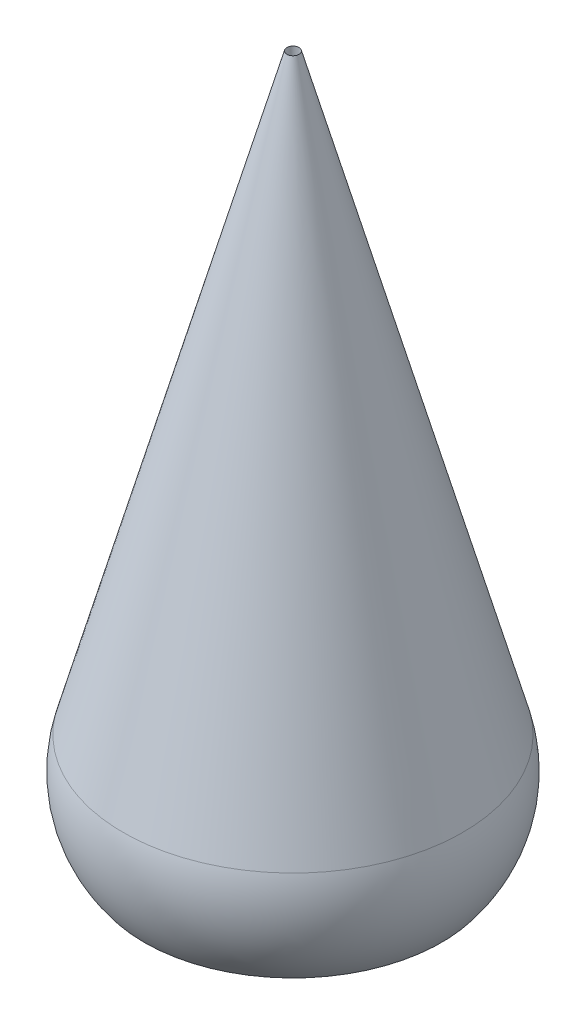
ISO-10303-21;
HEADER;
FILE_DESCRIPTION(('STEP AP214'),'2;1');
FILE_NAME('part.step','',(''),(''),'','','');
FILE_SCHEMA(('AUTOMOTIVE_DESIGN { 1 0 10303 214 1 1 1 1 }'));
ENDSEC;
DATA;
#1=APPLICATION_CONTEXT('core data for automotive mechanical design processes');
#2=APPLICATION_PROTOCOL_DEFINITION('international standard','automotive_design',2000,#1);
#3=PRODUCT_CONTEXT('',#1,'mechanical');
#4=PRODUCT('Part','Part','',(#3));
#5=PRODUCT_RELATED_PRODUCT_CATEGORY('part','',(#4));
#6=PRODUCT_DEFINITION_FORMATION('','',#4);
#7=PRODUCT_DEFINITION_CONTEXT('part definition',#1,'design');
#8=PRODUCT_DEFINITION('design','',#6,#7);
#9=PRODUCT_DEFINITION_SHAPE('','',#8);
#10=(LENGTH_UNIT() NAMED_UNIT(*) SI_UNIT(.MILLI.,.METRE.));
#11=(NAMED_UNIT(*) PLANE_ANGLE_UNIT() SI_UNIT($,.RADIAN.));
#12=(NAMED_UNIT(*) SI_UNIT($,.STERADIAN.) SOLID_ANGLE_UNIT());
#13=UNCERTAINTY_MEASURE_WITH_UNIT(LENGTH_MEASURE(1.E-05),#10,'distance_accuracy_value','');
#14=(GEOMETRIC_REPRESENTATION_CONTEXT(3) GLOBAL_UNCERTAINTY_ASSIGNED_CONTEXT((#13)) GLOBAL_UNIT_ASSIGNED_CONTEXT((#10,
#11,#12)) REPRESENTATION_CONTEXT('',''));
#15=CARTESIAN_POINT('',(0.,0.,0.));
#16=DIRECTION('',(0.,0.,1.));
#17=DIRECTION('',(1.,0.,0.));
#18=AXIS2_PLACEMENT_3D('',#15,#16,#17);
#19=CARTESIAN_POINT('',(0.,0.,0.));
#20=DIRECTION('',(0.,-1.,0.));
#21=DIRECTION('',(0.,0.,-1.));
#22=AXIS2_PLACEMENT_3D('',#19,#20,#21);
#23=CONICAL_SURFACE('',#22,12.4055754877515,0.269939481170051);
#24=CARTESIAN_POINT('',(0.,0.,0.));
#25=DIRECTION('',(0.,-1.,0.));
#26=DIRECTION('',(0.,0.,-1.));
#27=AXIS2_PLACEMENT_3D('',#24,#25,#26);
#28=CIRCLE('',#27,12.4055754877515);
#29=CARTESIAN_POINT('',(0.,0.,-12.4055754877515));
#30=VERTEX_POINT('',#29);
#31=EDGE_CURVE('E44',#30,#30,#28,.T.);
#32=CARTESIAN_POINT('',(0.,43.0281078034523,0.));
#33=DIRECTION('',(0.,-1.,0.));
#34=DIRECTION('',(0.,0.,-1.));
#35=AXIS2_PLACEMENT_3D('',#32,#33,#34);
#36=CIRCLE('',#35,0.5);
#37=CARTESIAN_POINT('',(0.,43.0281078034523,-0.500000000000002));
#38=VERTEX_POINT('',#37);
#39=EDGE_CURVE('E10',#38,#38,#36,.T.);
#40=CARTESIAN_POINT('',(0.,0.,-12.4055754877515));
#41=CARTESIAN_POINT('',(0.,0.448209456285961,-12.2815590764208));
#42=CARTESIAN_POINT('',(0.,0.896418912571923,-12.15754266509));
#43=CARTESIAN_POINT('',(0.,1.79283782514384,-11.9095098424286));
#44=CARTESIAN_POINT('',(0.,2.24104728142981,-11.7854934310978));
#45=CARTESIAN_POINT('',(0.,3.13746619400173,-11.5374606084363));
#46=CARTESIAN_POINT('',(0.,3.58567565028769,-11.4134441971056));
#47=CARTESIAN_POINT('',(0.,4.48209456285961,-11.1654113744441));
#48=CARTESIAN_POINT('',(0.,4.93030401914557,-11.0413949631133));
#49=CARTESIAN_POINT('',(0.,5.8267229317175,-10.7933621404518));
#50=CARTESIAN_POINT('',(0.,6.27493238800346,-10.6693457291211));
#51=CARTESIAN_POINT('',(0.,7.17135130057538,-10.4213129064596));
#52=CARTESIAN_POINT('',(0.,7.61956075686134,-10.2972964951289));
#53=CARTESIAN_POINT('',(0.,8.51597966943326,-10.0492636724674));
#54=CARTESIAN_POINT('',(0.,8.96418912571922,-9.92524726113663));
#55=CARTESIAN_POINT('',(0.,9.86060803829115,-9.67721443847514));
#56=CARTESIAN_POINT('',(0.,10.3088174945771,-9.5531980271444));
#57=CARTESIAN_POINT('',(0.,11.205236407149,-9.30516520448291));
#58=CARTESIAN_POINT('',(0.,11.653445863435,-9.18114879315216));
#59=CARTESIAN_POINT('',(0.,12.5498647760069,-8.93311597049067));
#60=CARTESIAN_POINT('',(0.,12.9980742322929,-8.80909955915993));
#61=CARTESIAN_POINT('',(0.,13.8944931448648,-8.56106673649844));
#62=CARTESIAN_POINT('',(0.,14.3427026011508,-8.43705032516769));
#63=CARTESIAN_POINT('',(0.,15.2391215137227,-8.1890175025062));
#64=CARTESIAN_POINT('',(0.,15.6873309700086,-8.06500109117546));
#65=CARTESIAN_POINT('',(0.,16.5837498825806,-7.81696826851396));
#66=CARTESIAN_POINT('',(0.,17.0319593388665,-7.69295185718322));
#67=CARTESIAN_POINT('',(0.,17.9283782514384,-7.44491903452173));
#68=CARTESIAN_POINT('',(0.,18.3765877077244,-7.32090262319098));
#69=CARTESIAN_POINT('',(0.,19.2730066202963,-7.07286980052949));
#70=CARTESIAN_POINT('',(0.,19.7212160765823,-6.94885338919875));
#71=CARTESIAN_POINT('',(0.,20.6176349891542,-6.70082056653726));
#72=CARTESIAN_POINT('',(0.,21.0658444454402,-6.57680415520651));
#73=CARTESIAN_POINT('',(0.,21.9622633580121,-6.32877133254502));
#74=CARTESIAN_POINT('',(0.,22.4104728142981,-6.20475492121428));
#75=CARTESIAN_POINT('',(0.,23.30689172687,-5.95672209855279));
#76=CARTESIAN_POINT('',(0.,23.7551011831559,-5.83270568722204));
#77=CARTESIAN_POINT('',(0.,24.6515200957279,-5.58467286456055));
#78=CARTESIAN_POINT('',(0.,25.0997295520138,-5.46065645322981));
#79=CARTESIAN_POINT('',(0.,25.9961484645857,-5.21262363056832));
#80=CARTESIAN_POINT('',(0.,26.4443579208717,-5.08860721923757));
#81=CARTESIAN_POINT('',(0.,27.3407768334436,-4.84057439657608));
#82=CARTESIAN_POINT('',(0.,27.7889862897296,-4.71655798524534));
#83=CARTESIAN_POINT('',(0.,28.6854052023015,-4.46852516258385));
#84=CARTESIAN_POINT('',(0.,29.1336146585875,-4.3445087512531));
#85=CARTESIAN_POINT('',(0.,30.0300335711594,-4.09647592859161));
#86=CARTESIAN_POINT('',(0.,30.4782430274454,-3.97245951726087));
#87=CARTESIAN_POINT('',(0.,31.3746619400173,-3.72442669459938));
#88=CARTESIAN_POINT('',(0.,31.8228713963032,-3.60041028326863));
#89=CARTESIAN_POINT('',(0.,32.7192903088752,-3.35237746060714));
#90=CARTESIAN_POINT('',(0.,33.1674997651611,-3.2283610492764));
#91=CARTESIAN_POINT('',(0.,34.063918677733,-2.9803282266149));
#92=CARTESIAN_POINT('',(0.,34.512128134019,-2.85631181528416));
#93=CARTESIAN_POINT('',(0.,35.4085470465909,-2.60827899262267));
#94=CARTESIAN_POINT('',(0.,35.8567565028769,-2.48426258129193));
#95=CARTESIAN_POINT('',(0.,36.7531754154488,-2.23622975863044));
#96=CARTESIAN_POINT('',(0.,37.2013848717348,-2.11221334729969));
#97=CARTESIAN_POINT('',(0.,38.0978037843067,-1.8641805246382));
#98=CARTESIAN_POINT('',(0.,38.5460132405927,-1.74016411330745));
#99=CARTESIAN_POINT('',(0.,39.4424321531646,-1.49213129064596));
#100=CARTESIAN_POINT('',(0.,39.8906416094505,-1.36811487931522));
#101=CARTESIAN_POINT('',(0.,40.7870605220225,-1.12008205665373));
#102=CARTESIAN_POINT('',(0.,41.2352699783084,-0.996065645322982));
#103=CARTESIAN_POINT('',(0.,42.1316888908803,-0.748032822661491));
#104=CARTESIAN_POINT('',(0.,42.5798983471663,-0.624016411330746));
#105=CARTESIAN_POINT('',(0.,43.0281078034523,-0.500000000000002));
#106=B_SPLINE_CURVE_WITH_KNOTS('',3,(#40,#41,#42,#43,#44,#45,#46,#47,#48,#49,#50,#51,#52,#53,
#54,#55,#56,#57,#58,#59,#60,#61,#62,#63,#64,#65,#66,#67,#68,#69,#70,#71,#72,#73,#74,#75,#76,#77,
#78,#79,#80,#81,#82,#83,#84,#85,#86,#87,#88,#89,#90,#91,#92,#93,#94,#95,#96,#97,#98,#99,#100,
#101,#102,#103,#104,#105),.UNSPECIFIED.,.F.,.F.,(4,2,2,2,2,2,2,2,2,2,2,2,2,2,2,2,2,2,2,2,2,2,2,
2,2,2,2,2,2,2,2,2,4),(0.,1.39515091758979,2.79030183517957,4.18545275276936,5.58060367035914,
6.97575458794893,8.37090550553872,9.7660564231285,11.1612073407183,12.5563582583081,
13.9515091758979,15.3466600934876,16.7418110110774,18.1369619286672,19.532112846257,
20.9272637638468,22.3224146814366,23.7175655990264,25.1127165166161,26.5078674342059,
27.9030183517957,29.2981692693855,30.6933201869753,32.0884711045651,33.4836220221549,
34.8787729397446,36.2739238573344,37.6690747749242,39.064225692514,40.4593766101038,
41.8545275276936,43.2496784452834,44.6448293628732),.UNSPECIFIED.);
#107=EDGE_CURVE('BSEAM32',#30,#38,#106,.T.);
#108=ORIENTED_EDGE('',*,*,#31,.T.);
#109=ORIENTED_EDGE('',*,*,#39,.F.);
#110=ORIENTED_EDGE('',*,*,#107,.T.);
#111=ORIENTED_EDGE('',*,*,#107,.F.);
#112=EDGE_LOOP('',(#108,#110,#109,#111));
#113=FACE_BOUND('',#112,.T.);
#114=ADVANCED_FACE('F32',(#113),#23,.F.);
#115=CARTESIAN_POINT('',(0.,60.,0.));
#116=DIRECTION('',(0.,-1.,0.));
#117=DIRECTION('',(0.,0.,-1.));
#118=AXIS2_PLACEMENT_3D('',#115,#116,#117);
#119=CONICAL_SURFACE('',#118,0.,0.269939481170051);
#120=CARTESIAN_POINT('',(0.,8.82039860241067,0.));
#121=DIRECTION('',(0.,1.,0.));
#122=DIRECTION('',(0.,0.,1.));
#123=AXIS2_PLACEMENT_3D('',#120,#121,#122);
#124=CIRCLE('',#123,14.1610365637121);
#125=CARTESIAN_POINT('',(0.,8.82039860241067,-14.1610365637121));
#126=VERTEX_POINT('',#125);
#127=EDGE_CURVE('E36',#126,#126,#124,.T.);
#128=CARTESIAN_POINT('',(0.,58.1929429682874,0.));
#129=DIRECTION('',(0.,-1.,0.));
#130=DIRECTION('',(0.,0.,-1.));
#131=AXIS2_PLACEMENT_3D('',#128,#129,#130);
#132=CIRCLE('',#131,0.5);
#133=CARTESIAN_POINT('',(0.,58.1929429682874,-0.499999999999999));
#134=VERTEX_POINT('',#133);
#135=EDGE_CURVE('E52',#134,#134,#132,.T.);
#136=CARTESIAN_POINT('',(0.,8.82039860241067,-14.1610365637121));
#137=CARTESIAN_POINT('',(0.,9.33469593955522,-14.0187340995068));
#138=CARTESIAN_POINT('',(0.,9.84899327669977,-13.8764316353014));
#139=CARTESIAN_POINT('',(0.,10.8775879509889,-13.5918267068908));
#140=CARTESIAN_POINT('',(0.,11.3918852881334,-13.4495242426854));
#141=CARTESIAN_POINT('',(0.,12.4204799624225,-13.1649193142748));
#142=CARTESIAN_POINT('',(0.,12.9347772995671,-13.0226168500694));
#143=CARTESIAN_POINT('',(0.,13.9633719738562,-12.7380119216588));
#144=CARTESIAN_POINT('',(0.,14.4776693110007,-12.5957094574534));
#145=CARTESIAN_POINT('',(0.,15.5062639852898,-12.3111045290428));
#146=CARTESIAN_POINT('',(0.,16.0205613224344,-12.1688020648374));
#147=CARTESIAN_POINT('',(0.,17.0491559967235,-11.8841971364267));
#148=CARTESIAN_POINT('',(0.,17.563453333868,-11.7418946722214));
#149=CARTESIAN_POINT('',(0.,18.5920480081571,-11.4572897438107));
#150=CARTESIAN_POINT('',(0.,19.1063453453017,-11.3149872796054));
#151=CARTESIAN_POINT('',(0.,20.1349400195908,-11.0303823511947));
#152=CARTESIAN_POINT('',(0.,20.6492373567353,-10.8880798869894));
#153=CARTESIAN_POINT('',(0.,21.6778320310244,-10.6034749585787));
#154=CARTESIAN_POINT('',(0.,22.192129368169,-10.4611724943734));
#155=CARTESIAN_POINT('',(0.,23.2207240424581,-10.1765675659627));
#156=CARTESIAN_POINT('',(0.,23.7350213796026,-10.0342651017574));
#157=CARTESIAN_POINT('',(0.,24.7636160538917,-9.74966017334673));
#158=CARTESIAN_POINT('',(0.,25.2779133910363,-9.6073577091414));
#159=CARTESIAN_POINT('',(0.,26.3065080653254,-9.32275278073073));
#160=CARTESIAN_POINT('',(0.,26.8208054024699,-9.1804503165254));
#161=CARTESIAN_POINT('',(0.,27.849400076759,-8.89584538811473));
#162=CARTESIAN_POINT('',(0.,28.3636974139036,-8.75354292390939));
#163=CARTESIAN_POINT('',(0.,29.3922920881927,-8.46893799549872));
#164=CARTESIAN_POINT('',(0.,29.9065894253372,-8.32663553129339));
#165=CARTESIAN_POINT('',(0.,30.9351840996263,-8.04203060288272));
#166=CARTESIAN_POINT('',(0.,31.4494814367708,-7.89972813867739));
#167=CARTESIAN_POINT('',(0.,32.47807611106,-7.61512321026672));
#168=CARTESIAN_POINT('',(0.,32.9923734482045,-7.47282074606138));
#169=CARTESIAN_POINT('',(0.,34.0209681224936,-7.18821581765071));
#170=CARTESIAN_POINT('',(0.,34.5352654596381,-7.04591335344538));
#171=CARTESIAN_POINT('',(0.,35.5638601339273,-6.76130842503471));
#172=CARTESIAN_POINT('',(0.,36.0781574710718,-6.61900596082938));
#173=CARTESIAN_POINT('',(0.,37.1067521453609,-6.33440103241871));
#174=CARTESIAN_POINT('',(0.,37.6210494825054,-6.19209856821337));
#175=CARTESIAN_POINT('',(0.,38.6496441567946,-5.90749363980271));
#176=CARTESIAN_POINT('',(0.,39.1639414939391,-5.76519117559737));
#177=CARTESIAN_POINT('',(0.,40.1925361682282,-5.4805862471867));
#178=CARTESIAN_POINT('',(0.,40.7068335053727,-5.33828378298137));
#179=CARTESIAN_POINT('',(0.,41.7354281796618,-5.0536788545707));
#180=CARTESIAN_POINT('',(0.,42.2497255168064,-4.91137639036537));
#181=CARTESIAN_POINT('',(0.,43.2783201910955,-4.6267714619547));
#182=CARTESIAN_POINT('',(0.,43.79261752824,-4.48446899774936));
#183=CARTESIAN_POINT('',(0.,44.8212122025291,-4.19986406933869));
#184=CARTESIAN_POINT('',(0.,45.3355095396737,-4.05756160513336));
#185=CARTESIAN_POINT('',(0.,46.3641042139628,-3.77295667672269));
#186=CARTESIAN_POINT('',(0.,46.8784015511073,-3.63065421251736));
#187=CARTESIAN_POINT('',(0.,47.9069962253964,-3.34604928410669));
#188=CARTESIAN_POINT('',(0.,48.421293562541,-3.20374681990135));
#189=CARTESIAN_POINT('',(0.,49.4498882368301,-2.91914189149068));
#190=CARTESIAN_POINT('',(0.,49.9641855739746,-2.77683942728535));
#191=CARTESIAN_POINT('',(0.,50.9927802482637,-2.49223449887468));
#192=CARTESIAN_POINT('',(0.,51.5070775854083,-2.34993203466935));
#193=CARTESIAN_POINT('',(0.,52.5356722596974,-2.06532710625868));
#194=CARTESIAN_POINT('',(0.,53.0499695968419,-1.92302464205334));
#195=CARTESIAN_POINT('',(0.,54.078564271131,-1.63841971364268));
#196=CARTESIAN_POINT('',(0.,54.5928616082756,-1.49611724943734));
#197=CARTESIAN_POINT('',(0.,55.6214562825647,-1.21151232102667));
#198=CARTESIAN_POINT('',(0.,56.1357536197092,-1.06920985682134));
#199=CARTESIAN_POINT('',(0.,57.1643482939983,-0.784604928410669));
#200=CARTESIAN_POINT('',(0.,57.6786456311429,-0.642302464205335));
#201=CARTESIAN_POINT('',(0.,58.1929429682874,-0.5));
#202=B_SPLINE_CURVE_WITH_KNOTS('',3,(#136,#137,#138,#139,#140,#141,#142,#143,#144,#145,#146,
#147,#148,#149,#150,#151,#152,#153,#154,#155,#156,#157,#158,#159,#160,#161,#162,#163,#164,#165,
#166,#167,#168,#169,#170,#171,#172,#173,#174,#175,#176,#177,#178,#179,#180,#181,#182,#183,#184,
#185,#186,#187,#188,#189,#190,#191,#192,#193,#194,#195,#196,#197,#198,#199,#200,#201),
.UNSPECIFIED.,.F.,.F.,(4,2,2,2,2,2,2,2,2,2,2,2,2,2,2,2,2,2,2,2,2,2,2,2,2,2,2,2,2,2,2,2,4),(0.,
1.60086404195234,3.20172808390467,4.80259212585701,6.40345616780934,8.00432020976167,
9.605184251714,11.2060482936663,12.8069123356187,14.407776377571,16.0086404195233,
17.6095044614757,19.210368503428,20.8112325453803,22.4120965873327,24.012960629285,
25.6138246712373,27.2146887131897,28.815552755142,30.4164167970943,32.0172808390467,
33.618144880999,35.2190089229514,36.8198729649037,38.420737006856,40.0216010488084,
41.6224650907607,43.223329132713,44.8241931746654,46.4250572166177,48.02592125857,
49.6267853005224,51.2276493424747),.UNSPECIFIED.);
#203=EDGE_CURVE('BSEAM79',#126,#134,#202,.T.);
#204=ORIENTED_EDGE('',*,*,#127,.T.);
#205=ORIENTED_EDGE('',*,*,#135,.T.);
#206=ORIENTED_EDGE('',*,*,#203,.T.);
#207=ORIENTED_EDGE('',*,*,#203,.F.);
#208=EDGE_LOOP('',(#204,#206,#205,#207));
#209=FACE_BOUND('',#208,.T.);
#210=ADVANCED_FACE('F79',(#209),#119,.T.);
#211=CARTESIAN_POINT('',(0.,6.15366750327643,0.));
#212=DIRECTION('',(0.,-1.,0.));
#213=DIRECTION('',(0.,0.,-1.));
#214=AXIS2_PLACEMENT_3D('',#211,#212,#213);
#215=DEGENERATE_TOROIDAL_SURFACE('',#214,4.52316619495789,10.,.T.);
#216=ORIENTED_EDGE('',*,*,#127,.F.);
#217=EDGE_LOOP('',(#216));
#218=FACE_BOUND('',#217,.T.);
#219=ORIENTED_EDGE('',*,*,#31,.F.);
#220=EDGE_LOOP('',(#219));
#221=FACE_BOUND('',#220,.T.);
#222=ADVANCED_FACE('F34',(#218,#221),#215,.T.);
#223=CARTESIAN_POINT('',(0.,60.,0.));
#224=DIRECTION('',(0.,-1.,0.));
#225=DIRECTION('',(0.,0.,-1.));
#226=AXIS2_PLACEMENT_3D('',#223,#224,#225);
#227=CYLINDRICAL_SURFACE('',#226,0.5);
#228=CARTESIAN_POINT('',(0.,0.,0.));
#229=DIRECTION('',(0.,1.,0.));
#230=DIRECTION('',(0.,0.,1.));
#231=AXIS2_PLACEMENT_3D('',#228,#229,#230);
#232=CIRCLE('',#231,0.5);
#233=CARTESIAN_POINT('',(0.,0.,0.5));
#234=VERTEX_POINT('',#233);
#235=EDGE_CURVE('E46',#234,#234,#232,.T.);
#236=ORIENTED_EDGE('',*,*,#235,.T.);
#237=EDGE_LOOP('',(#236));
#238=FACE_BOUND('',#237,.T.);
#239=ORIENTED_EDGE('',*,*,#39,.T.);
#240=EDGE_LOOP('',(#239));
#241=FACE_BOUND('',#240,.T.);
#242=ADVANCED_FACE('F75',(#238,#241),#227,.T.);
#243=CARTESIAN_POINT('',(0.,0.,0.));
#244=DIRECTION('',(0.,1.,0.));
#245=DIRECTION('',(0.,0.,1.));
#246=AXIS2_PLACEMENT_3D('',#243,#244,#245);
#247=PLANE('',#246);
#248=ORIENTED_EDGE('',*,*,#235,.F.);
#249=EDGE_LOOP('',(#248));
#250=FACE_BOUND('',#249,.T.);
#251=ADVANCED_FACE('F68',(#250),#247,.F.);
#252=CARTESIAN_POINT('',(0.,55.,0.));
#253=DIRECTION('',(0.,1.,0.));
#254=DIRECTION('',(0.,0.,1.));
#255=AXIS2_PLACEMENT_3D('',#252,#253,#254);
#256=CYLINDRICAL_SURFACE('',#255,0.5);
#257=CARTESIAN_POINT('',(0.,55.,0.));
#258=DIRECTION('',(0.,1.,0.));
#259=DIRECTION('',(0.,0.,1.));
#260=AXIS2_PLACEMENT_3D('',#257,#258,#259);
#261=CIRCLE('',#260,0.5);
#262=CARTESIAN_POINT('',(0.,55.,0.5));
#263=VERTEX_POINT('',#262);
#264=EDGE_CURVE('E56',#263,#263,#261,.T.);
#265=ORIENTED_EDGE('',*,*,#264,.F.);
#266=EDGE_LOOP('',(#265));
#267=FACE_BOUND('',#266,.T.);
#268=ORIENTED_EDGE('',*,*,#135,.F.);
#269=EDGE_LOOP('',(#268));
#270=FACE_BOUND('',#269,.T.);
#271=ADVANCED_FACE('F65',(#267,#270),#256,.F.);
#272=CARTESIAN_POINT('',(0.,55.,0.));
#273=DIRECTION('',(0.,1.,0.));
#274=DIRECTION('',(0.,0.,1.));
#275=AXIS2_PLACEMENT_3D('',#272,#273,#274);
#276=PLANE('',#275);
#277=ORIENTED_EDGE('',*,*,#264,.T.);
#278=EDGE_LOOP('',(#277));
#279=FACE_BOUND('',#278,.T.);
#280=ADVANCED_FACE('F63',(#279),#276,.T.);
#281=CLOSED_SHELL('',(#114,#210,#222,#242,#251,#271,#280));
#282=MANIFOLD_SOLID_BREP('B2',#281);
#283=ADVANCED_BREP_SHAPE_REPRESENTATION('',(#18,#282),#14);
#284=SHAPE_DEFINITION_REPRESENTATION(#9,#283);
ENDSEC;
END-ISO-10303-21;
